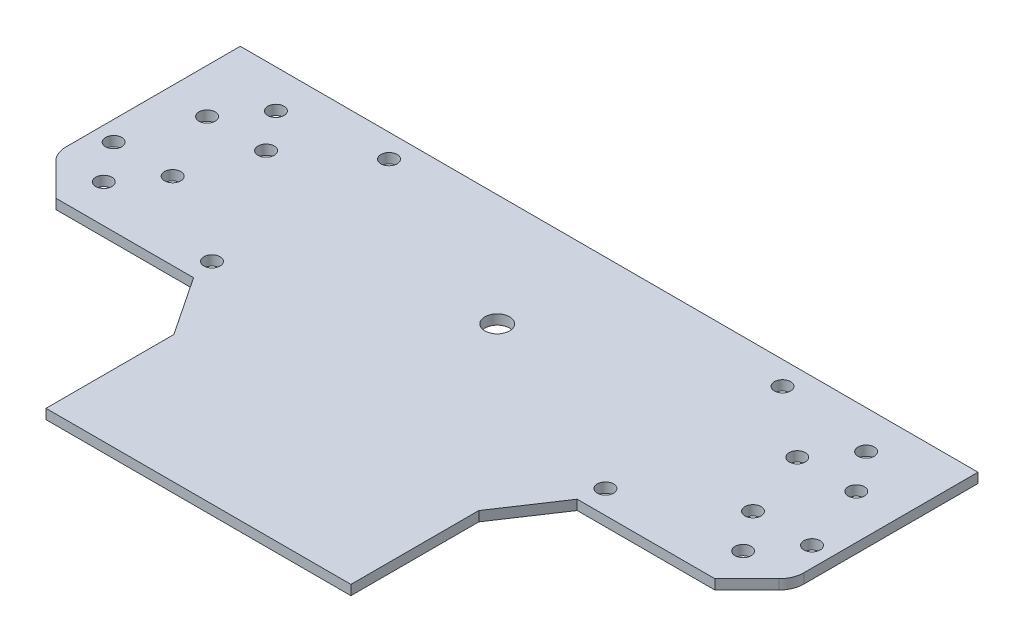
ISO-10303-21;
HEADER;
FILE_DESCRIPTION(('STEP AP214'),'2;1');
FILE_NAME('part.step','',(''),(''),'','','');
FILE_SCHEMA(('AUTOMOTIVE_DESIGN { 1 0 10303 214 1 1 1 1 }'));
ENDSEC;
DATA;
#1=APPLICATION_CONTEXT('core data for automotive mechanical design processes');
#2=APPLICATION_PROTOCOL_DEFINITION('international standard','automotive_design',2000,#1);
#3=PRODUCT_CONTEXT('',#1,'mechanical');
#4=PRODUCT('Part','Part','',(#3));
#5=PRODUCT_RELATED_PRODUCT_CATEGORY('part','',(#4));
#6=PRODUCT_DEFINITION_FORMATION('','',#4);
#7=PRODUCT_DEFINITION_CONTEXT('part definition',#1,'design');
#8=PRODUCT_DEFINITION('design','',#6,#7);
#9=PRODUCT_DEFINITION_SHAPE('','',#8);
#10=(LENGTH_UNIT() NAMED_UNIT(*) SI_UNIT(.MILLI.,.METRE.));
#11=(NAMED_UNIT(*) PLANE_ANGLE_UNIT() SI_UNIT($,.RADIAN.));
#12=(NAMED_UNIT(*) SI_UNIT($,.STERADIAN.) SOLID_ANGLE_UNIT());
#13=UNCERTAINTY_MEASURE_WITH_UNIT(LENGTH_MEASURE(1.E-05),#10,'distance_accuracy_value','');
#14=(GEOMETRIC_REPRESENTATION_CONTEXT(3) GLOBAL_UNCERTAINTY_ASSIGNED_CONTEXT((#13)) GLOBAL_UNIT_ASSIGNED_CONTEXT((#10,
#11,#12)) REPRESENTATION_CONTEXT('',''));
#15=CARTESIAN_POINT('',(0.,0.,0.));
#16=DIRECTION('',(0.,0.,1.));
#17=DIRECTION('',(1.,0.,0.));
#18=AXIS2_PLACEMENT_3D('',#15,#16,#17);
#19=CARTESIAN_POINT('',(-75.,2.,22.75));
#20=DIRECTION('',(0.,0.,-1.));
#21=DIRECTION('',(-1.,0.,0.));
#22=AXIS2_PLACEMENT_3D('',#19,#20,#21);
#23=PLANE('',#22);
#24=DIRECTION('',(0.,-1.,0.));
#25=VECTOR('',#24,1.);
#26=CARTESIAN_POINT('',(39.,16.422205101856,22.75));
#27=LINE('',#26,#25);
#28=CARTESIAN_POINT('',(39.,2.,22.75));
#29=VERTEX_POINT('',#28);
#30=CARTESIAN_POINT('',(39.,0.,22.75));
#31=VERTEX_POINT('',#30);
#32=EDGE_CURVE('E55',#29,#31,#27,.T.);
#33=ORIENTED_EDGE('',*,*,#32,.T.);
#34=DIRECTION('',(1.,0.,0.));
#35=VECTOR('',#34,1.);
#36=CARTESIAN_POINT('',(-75.,0.,22.75));
#37=LINE('',#36,#35);
#38=CARTESIAN_POINT('',(66.9999999999999,0.,22.75));
#39=VERTEX_POINT('',#38);
#40=EDGE_CURVE('E303',#31,#39,#37,.T.);
#41=ORIENTED_EDGE('',*,*,#40,.T.);
#42=DIRECTION('',(0.,1.,0.));
#43=VECTOR('',#42,1.);
#44=CARTESIAN_POINT('',(66.9999999999999,2.,22.75));
#45=LINE('',#44,#43);
#46=CARTESIAN_POINT('',(66.9999999999999,2.,22.75));
#47=VERTEX_POINT('',#46);
#48=EDGE_CURVE('E319',#39,#47,#45,.T.);
#49=ORIENTED_EDGE('',*,*,#48,.T.);
#50=DIRECTION('',(1.,0.,0.));
#51=VECTOR('',#50,1.);
#52=CARTESIAN_POINT('',(-75.,2.,22.75));
#53=LINE('',#52,#51);
#54=EDGE_CURVE('E50',#29,#47,#53,.T.);
#55=ORIENTED_EDGE('',*,*,#54,.F.);
#56=EDGE_LOOP('',(#33,#41,#49,#55));
#57=FACE_BOUND('',#56,.T.);
#58=ADVANCED_FACE('F35',(#57),#23,.F.);
#59=CARTESIAN_POINT('',(31.,74.7186358507914,60.75));
#60=DIRECTION('',(-1.,0.,0.));
#61=DIRECTION('',(0.,0.,1.));
#62=AXIS2_PLACEMENT_3D('',#59,#60,#61);
#63=PLANE('',#62);
#64=DIRECTION('',(0.,-1.,0.));
#65=VECTOR('',#64,1.);
#66=CARTESIAN_POINT('',(31.,16.422205101856,34.75));
#67=LINE('',#66,#65);
#68=CARTESIAN_POINT('',(31.,2.,34.75));
#69=VERTEX_POINT('',#68);
#70=CARTESIAN_POINT('',(31.,0.,34.75));
#71=VERTEX_POINT('',#70);
#72=EDGE_CURVE('E147',#69,#71,#67,.T.);
#73=ORIENTED_EDGE('',*,*,#72,.F.);
#74=DIRECTION('',(0.,0.,1.));
#75=VECTOR('',#74,1.);
#76=CARTESIAN_POINT('',(31.,2.,60.75));
#77=LINE('',#76,#75);
#78=CARTESIAN_POINT('',(31.,2.,60.75));
#79=VERTEX_POINT('',#78);
#80=EDGE_CURVE('E133',#69,#79,#77,.T.);
#81=ORIENTED_EDGE('',*,*,#80,.T.);
#82=DIRECTION('',(0.,-1.,0.));
#83=VECTOR('',#82,1.);
#84=CARTESIAN_POINT('',(31.,74.7186358507914,60.75));
#85=LINE('',#84,#83);
#86=CARTESIAN_POINT('',(31.,0.,60.75));
#87=VERTEX_POINT('',#86);
#88=EDGE_CURVE('E177',#79,#87,#85,.T.);
#89=ORIENTED_EDGE('',*,*,#88,.T.);
#90=DIRECTION('',(0.,0.,-1.));
#91=VECTOR('',#90,1.);
#92=CARTESIAN_POINT('',(31.,0.,60.75));
#93=LINE('',#92,#91);
#94=EDGE_CURVE('E150',#87,#71,#93,.T.);
#95=ORIENTED_EDGE('',*,*,#94,.T.);
#96=EDGE_LOOP('',(#73,#81,#89,#95));
#97=FACE_BOUND('',#96,.T.);
#98=ADVANCED_FACE('F148',(#97),#63,.F.);
#99=DIRECTION('',(0.,-1.,0.));
#100=VECTOR('',#99,1.);
#101=CARTESIAN_POINT('',(-39.,16.422205101856,22.75));
#102=LINE('',#101,#100);
#103=CARTESIAN_POINT('',(-39.,2.,22.75));
#104=VERTEX_POINT('',#103);
#105=CARTESIAN_POINT('',(-39.,0.,22.75));
#106=VERTEX_POINT('',#105);
#107=EDGE_CURVE('E165',#104,#106,#102,.T.);
#108=ORIENTED_EDGE('',*,*,#107,.F.);
#109=CARTESIAN_POINT('',(-67.,2.,22.75));
#110=VERTEX_POINT('',#109);
#111=EDGE_CURVE('E293',#110,#104,#53,.T.);
#112=ORIENTED_EDGE('',*,*,#111,.F.);
#113=DIRECTION('',(0.,-1.,0.));
#114=VECTOR('',#113,1.);
#115=CARTESIAN_POINT('',(-67.,2.,22.75));
#116=LINE('',#115,#114);
#117=CARTESIAN_POINT('',(-67.,0.,22.75));
#118=VERTEX_POINT('',#117);
#119=EDGE_CURVE('E316',#110,#118,#116,.T.);
#120=ORIENTED_EDGE('',*,*,#119,.T.);
#121=EDGE_CURVE('E288',#118,#106,#37,.T.);
#122=ORIENTED_EDGE('',*,*,#121,.T.);
#123=EDGE_LOOP('',(#108,#112,#120,#122));
#124=FACE_BOUND('',#123,.T.);
#125=ADVANCED_FACE('F366',(#124),#23,.F.);
#126=CARTESIAN_POINT('',(-31.,74.7186358507914,60.75));
#127=DIRECTION('',(1.,0.,0.));
#128=DIRECTION('',(0.,0.,-1.));
#129=AXIS2_PLACEMENT_3D('',#126,#127,#128);
#130=PLANE('',#129);
#131=DIRECTION('',(0.,-1.,0.));
#132=VECTOR('',#131,1.);
#133=CARTESIAN_POINT('',(-31.,16.422205101856,34.75));
#134=LINE('',#133,#132);
#135=CARTESIAN_POINT('',(-31.,2.,34.75));
#136=VERTEX_POINT('',#135);
#137=CARTESIAN_POINT('',(-31.,0.,34.75));
#138=VERTEX_POINT('',#137);
#139=EDGE_CURVE('E159',#136,#138,#134,.T.);
#140=ORIENTED_EDGE('',*,*,#139,.T.);
#141=DIRECTION('',(0.,0.,1.));
#142=VECTOR('',#141,1.);
#143=CARTESIAN_POINT('',(-31.,0.,60.75));
#144=LINE('',#143,#142);
#145=CARTESIAN_POINT('',(-31.,0.,60.75));
#146=VERTEX_POINT('',#145);
#147=EDGE_CURVE('E172',#138,#146,#144,.T.);
#148=ORIENTED_EDGE('',*,*,#147,.T.);
#149=DIRECTION('',(0.,-1.,0.));
#150=VECTOR('',#149,1.);
#151=CARTESIAN_POINT('',(-31.,74.7186358507914,60.75));
#152=LINE('',#151,#150);
#153=CARTESIAN_POINT('',(-31.,2.,60.75));
#154=VERTEX_POINT('',#153);
#155=EDGE_CURVE('E179',#154,#146,#152,.T.);
#156=ORIENTED_EDGE('',*,*,#155,.F.);
#157=DIRECTION('',(0.,0.,-1.));
#158=VECTOR('',#157,1.);
#159=CARTESIAN_POINT('',(-31.,2.,60.75));
#160=LINE('',#159,#158);
#161=EDGE_CURVE('E144',#154,#136,#160,.T.);
#162=ORIENTED_EDGE('',*,*,#161,.T.);
#163=EDGE_LOOP('',(#140,#148,#156,#162));
#164=FACE_BOUND('',#163,.T.);
#165=ADVANCED_FACE('F375',(#164),#130,.F.);
#166=CARTESIAN_POINT('',(75.,2.,22.75));
#167=DIRECTION('',(-1.,0.,0.));
#168=DIRECTION('',(0.,0.,1.));
#169=AXIS2_PLACEMENT_3D('',#166,#167,#168);
#170=PLANE('',#169);
#171=DIRECTION('',(0.,0.,-1.));
#172=VECTOR('',#171,1.);
#173=CARTESIAN_POINT('',(75.,2.,22.75));
#174=LINE('',#173,#172);
#175=CARTESIAN_POINT('',(75.,2.,12.6789321881345));
#176=VERTEX_POINT('',#175);
#177=CARTESIAN_POINT('',(75.,2.,-22.75));
#178=VERTEX_POINT('',#177);
#179=EDGE_CURVE('E285',#176,#178,#174,.T.);
#180=ORIENTED_EDGE('',*,*,#179,.F.);
#181=DIRECTION('',(0.,1.,0.));
#182=VECTOR('',#181,1.);
#183=CARTESIAN_POINT('',(75.,0.,12.6789321881345));
#184=LINE('',#183,#182);
#185=CARTESIAN_POINT('',(75.,0.,12.6789321881345));
#186=VERTEX_POINT('',#185);
#187=EDGE_CURVE('E326',#176,#186,#184,.F.);
#188=ORIENTED_EDGE('',*,*,#187,.T.);
#189=DIRECTION('',(0.,0.,-1.));
#190=VECTOR('',#189,1.);
#191=CARTESIAN_POINT('',(75.,0.,22.75));
#192=LINE('',#191,#190);
#193=CARTESIAN_POINT('',(75.,0.,-22.75));
#194=VERTEX_POINT('',#193);
#195=EDGE_CURVE('E252',#186,#194,#192,.T.);
#196=ORIENTED_EDGE('',*,*,#195,.T.);
#197=DIRECTION('',(0.,-1.,0.));
#198=VECTOR('',#197,1.);
#199=CARTESIAN_POINT('',(75.,2.,-22.75));
#200=LINE('',#199,#198);
#201=EDGE_CURVE('E307',#178,#194,#200,.T.);
#202=ORIENTED_EDGE('',*,*,#201,.F.);
#203=EDGE_LOOP('',(#180,#188,#196,#202));
#204=FACE_BOUND('',#203,.T.);
#205=ADVANCED_FACE('F391',(#204),#170,.F.);
#206=CARTESIAN_POINT('',(-75.,2.,-22.75));
#207=DIRECTION('',(0.,0.,1.));
#208=DIRECTION('',(1.,0.,0.));
#209=AXIS2_PLACEMENT_3D('',#206,#207,#208);
#210=PLANE('',#209);
#211=DIRECTION('',(-1.,0.,0.));
#212=VECTOR('',#211,1.);
#213=CARTESIAN_POINT('',(-75.,0.,-22.75));
#214=LINE('',#213,#212);
#215=CARTESIAN_POINT('',(-75.,0.,-22.75));
#216=VERTEX_POINT('',#215);
#217=EDGE_CURVE('E298',#194,#216,#214,.T.);
#218=ORIENTED_EDGE('',*,*,#217,.T.);
#219=DIRECTION('',(0.,-1.,0.));
#220=VECTOR('',#219,1.);
#221=CARTESIAN_POINT('',(-75.,2.,-22.75));
#222=LINE('',#221,#220);
#223=CARTESIAN_POINT('',(-75.,2.,-22.75));
#224=VERTEX_POINT('',#223);
#225=EDGE_CURVE('E296',#224,#216,#222,.T.);
#226=ORIENTED_EDGE('',*,*,#225,.F.);
#227=DIRECTION('',(-1.,0.,0.));
#228=VECTOR('',#227,1.);
#229=CARTESIAN_POINT('',(-75.,2.,-22.75));
#230=LINE('',#229,#228);
#231=EDGE_CURVE('E287',#178,#224,#230,.T.);
#232=ORIENTED_EDGE('',*,*,#231,.F.);
#233=ORIENTED_EDGE('',*,*,#201,.T.);
#234=EDGE_LOOP('',(#218,#226,#232,#233));
#235=FACE_BOUND('',#234,.T.);
#236=ADVANCED_FACE('F352',(#235),#210,.F.);
#237=CARTESIAN_POINT('',(-75.,2.,22.75));
#238=DIRECTION('',(1.,0.,0.));
#239=DIRECTION('',(0.,0.,-1.));
#240=AXIS2_PLACEMENT_3D('',#237,#238,#239);
#241=PLANE('',#240);
#242=DIRECTION('',(0.,0.,1.));
#243=VECTOR('',#242,1.);
#244=CARTESIAN_POINT('',(-75.,0.,22.75));
#245=LINE('',#244,#243);
#246=CARTESIAN_POINT('',(-75.,0.,12.6789321881345));
#247=VERTEX_POINT('',#246);
#248=EDGE_CURVE('E300',#216,#247,#245,.T.);
#249=ORIENTED_EDGE('',*,*,#248,.T.);
#250=DIRECTION('',(0.,-1.,0.));
#251=VECTOR('',#250,1.);
#252=CARTESIAN_POINT('',(-75.,2.,12.6789321881345));
#253=LINE('',#252,#251);
#254=CARTESIAN_POINT('',(-75.,2.,12.6789321881345));
#255=VERTEX_POINT('',#254);
#256=EDGE_CURVE('E43',#247,#255,#253,.F.);
#257=ORIENTED_EDGE('',*,*,#256,.T.);
#258=DIRECTION('',(0.,0.,1.));
#259=VECTOR('',#258,1.);
#260=CARTESIAN_POINT('',(-75.,2.,22.75));
#261=LINE('',#260,#259);
#262=EDGE_CURVE('E290',#224,#255,#261,.T.);
#263=ORIENTED_EDGE('',*,*,#262,.F.);
#264=ORIENTED_EDGE('',*,*,#225,.T.);
#265=EDGE_LOOP('',(#249,#257,#263,#264));
#266=FACE_BOUND('',#265,.T.);
#267=ADVANCED_FACE('F342',(#266),#241,.F.);
#268=CARTESIAN_POINT('',(0.,2.,0.));
#269=DIRECTION('',(0.,-1.,0.));
#270=DIRECTION('',(0.,0.,-1.));
#271=AXIS2_PLACEMENT_3D('',#268,#269,#270);
#272=PLANE('',#271);
#273=DIRECTION('',(-0.554700196225229,0.,0.832050294337844));
#274=VECTOR('',#273,1.);
#275=CARTESIAN_POINT('',(31.,2.,34.75));
#276=LINE('',#275,#274);
#277=EDGE_CURVE('E138',#29,#69,#276,.T.);
#278=ORIENTED_EDGE('',*,*,#277,.F.);
#279=ORIENTED_EDGE('',*,*,#54,.T.);
#280=DIRECTION('',(-0.707106781186549,0.,0.707106781186546));
#281=VECTOR('',#280,1.);
#282=CARTESIAN_POINT('',(75.,2.,14.75));
#283=LINE('',#282,#281);
#284=CARTESIAN_POINT('',(73.5355339059327,2.,16.2144660940673));
#285=VERTEX_POINT('',#284);
#286=EDGE_CURVE('E323',#47,#285,#283,.F.);
#287=ORIENTED_EDGE('',*,*,#286,.T.);
#288=CARTESIAN_POINT('',(70.,2.,12.6789321881345));
#289=DIRECTION('',(0.,-1.,0.));
#290=DIRECTION('',(0.,0.,-1.));
#291=AXIS2_PLACEMENT_3D('',#288,#289,#290);
#292=CIRCLE('',#291,5.);
#293=EDGE_CURVE('E337',#285,#176,#292,.F.);
#294=ORIENTED_EDGE('',*,*,#293,.T.);
#295=ORIENTED_EDGE('',*,*,#179,.T.);
#296=ORIENTED_EDGE('',*,*,#231,.T.);
#297=ORIENTED_EDGE('',*,*,#262,.T.);
#298=CARTESIAN_POINT('',(-70.,2.,12.6789321881345));
#299=DIRECTION('',(0.,-1.,0.));
#300=DIRECTION('',(0.,0.,-1.));
#301=AXIS2_PLACEMENT_3D('',#298,#299,#300);
#302=CIRCLE('',#301,5.);
#303=CARTESIAN_POINT('',(-73.5355339059328,2.,16.2144660940673));
#304=VERTEX_POINT('',#303);
#305=EDGE_CURVE('E335',#255,#304,#302,.F.);
#306=ORIENTED_EDGE('',*,*,#305,.T.);
#307=DIRECTION('',(-0.707106781186547,0.,-0.707106781186548));
#308=VECTOR('',#307,1.);
#309=CARTESIAN_POINT('',(-67.,2.,22.75));
#310=LINE('',#309,#308);
#311=EDGE_CURVE('E321',#304,#110,#310,.F.);
#312=ORIENTED_EDGE('',*,*,#311,.T.);
#313=ORIENTED_EDGE('',*,*,#111,.T.);
#314=DIRECTION('',(-0.554700196225229,0.,-0.832050294337844));
#315=VECTOR('',#314,1.);
#316=CARTESIAN_POINT('',(-31.,2.,34.75));
#317=LINE('',#316,#315);
#318=EDGE_CURVE('E163',#136,#104,#317,.T.);
#319=ORIENTED_EDGE('',*,*,#318,.F.);
#320=ORIENTED_EDGE('',*,*,#161,.F.);
#321=DIRECTION('',(-1.,0.,0.));
#322=VECTOR('',#321,1.);
#323=CARTESIAN_POINT('',(-31.,2.,60.75));
#324=LINE('',#323,#322);
#325=EDGE_CURVE('E140',#79,#154,#324,.T.);
#326=ORIENTED_EDGE('',*,*,#325,.F.);
#327=ORIENTED_EDGE('',*,*,#80,.F.);
#328=EDGE_LOOP('',(#278,#279,#287,#294,#295,#296,#297,#306,#312,#313,#319,#320,#326,#327));
#329=FACE_BOUND('',#328,.T.);
#330=CARTESIAN_POINT('',(-40.,2.,18.));
#331=DIRECTION('',(0.,1.,0.));
#332=DIRECTION('',(0.,0.,1.));
#333=AXIS2_PLACEMENT_3D('',#330,#331,#332);
#334=CIRCLE('',#333,1.65);
#335=CARTESIAN_POINT('',(-40.,2.,19.65));
#336=VERTEX_POINT('',#335);
#337=EDGE_CURVE('E189',#336,#336,#334,.T.);
#338=ORIENTED_EDGE('',*,*,#337,.F.);
#339=EDGE_LOOP('',(#338));
#340=FACE_BOUND('',#339,.T.);
#341=CARTESIAN_POINT('',(40.,2.,-18.));
#342=DIRECTION('',(0.,1.,0.));
#343=DIRECTION('',(0.,0.,1.));
#344=AXIS2_PLACEMENT_3D('',#341,#342,#343);
#345=CIRCLE('',#344,1.65);
#346=CARTESIAN_POINT('',(40.,2.,-16.35));
#347=VERTEX_POINT('',#346);
#348=EDGE_CURVE('E196',#347,#347,#345,.T.);
#349=ORIENTED_EDGE('',*,*,#348,.F.);
#350=EDGE_LOOP('',(#349));
#351=FACE_BOUND('',#350,.T.);
#352=CARTESIAN_POINT('',(40.,2.,18.));
#353=DIRECTION('',(0.,1.,0.));
#354=DIRECTION('',(0.,0.,1.));
#355=AXIS2_PLACEMENT_3D('',#352,#353,#354);
#356=CIRCLE('',#355,1.65);
#357=CARTESIAN_POINT('',(40.,2.,19.65));
#358=VERTEX_POINT('',#357);
#359=EDGE_CURVE('E183',#358,#358,#356,.T.);
#360=ORIENTED_EDGE('',*,*,#359,.F.);
#361=EDGE_LOOP('',(#360));
#362=FACE_BOUND('',#361,.T.);
#363=CARTESIAN_POINT('',(-40.,2.,-18.));
#364=DIRECTION('',(0.,1.,0.));
#365=DIRECTION('',(0.,0.,1.));
#366=AXIS2_PLACEMENT_3D('',#363,#364,#365);
#367=CIRCLE('',#366,1.65);
#368=CARTESIAN_POINT('',(-40.,2.,-16.35));
#369=VERTEX_POINT('',#368);
#370=EDGE_CURVE('E201',#369,#369,#367,.T.);
#371=ORIENTED_EDGE('',*,*,#370,.F.);
#372=EDGE_LOOP('',(#371));
#373=FACE_BOUND('',#372,.T.);
#374=CARTESIAN_POINT('',(0.,2.,0.));
#375=DIRECTION('',(0.,1.,0.));
#376=DIRECTION('',(0.,0.,1.));
#377=AXIS2_PLACEMENT_3D('',#374,#375,#376);
#378=CIRCLE('',#377,2.5);
#379=CARTESIAN_POINT('',(0.,2.,2.5));
#380=VERTEX_POINT('',#379);
#381=EDGE_CURVE('E207',#380,#380,#378,.T.);
#382=ORIENTED_EDGE('',*,*,#381,.F.);
#383=EDGE_LOOP('',(#382));
#384=FACE_BOUND('',#383,.T.);
#385=CARTESIAN_POINT('',(60.,2.,-15.));
#386=DIRECTION('',(0.,-1.,0.));
#387=DIRECTION('',(0.,0.,1.));
#388=AXIS2_PLACEMENT_3D('',#385,#386,#387);
#389=CIRCLE('',#388,1.64999999999999);
#390=CARTESIAN_POINT('',(60.,2.,-13.35));
#391=VERTEX_POINT('',#390);
#392=EDGE_CURVE('E213',#391,#391,#389,.T.);
#393=ORIENTED_EDGE('',*,*,#392,.T.);
#394=EDGE_LOOP('',(#393));
#395=FACE_BOUND('',#394,.T.);
#396=CARTESIAN_POINT('',(65.9999999999999,2.,-7.));
#397=DIRECTION('',(0.,-1.,0.));
#398=DIRECTION('',(0.,0.,1.));
#399=AXIS2_PLACEMENT_3D('',#396,#397,#398);
#400=CIRCLE('',#399,1.65);
#401=CARTESIAN_POINT('',(65.9999999999999,2.,-5.35));
#402=VERTEX_POINT('',#401);
#403=EDGE_CURVE('E221',#402,#402,#400,.T.);
#404=ORIENTED_EDGE('',*,*,#403,.T.);
#405=EDGE_LOOP('',(#404));
#406=FACE_BOUND('',#405,.T.);
#407=CARTESIAN_POINT('',(54.,2.,-7.));
#408=DIRECTION('',(0.,-1.,0.));
#409=DIRECTION('',(0.,0.,1.));
#410=AXIS2_PLACEMENT_3D('',#407,#408,#409);
#411=CIRCLE('',#410,1.65);
#412=CARTESIAN_POINT('',(54.,2.,-5.35));
#413=VERTEX_POINT('',#412);
#414=EDGE_CURVE('E227',#413,#413,#411,.T.);
#415=ORIENTED_EDGE('',*,*,#414,.T.);
#416=EDGE_LOOP('',(#415));
#417=FACE_BOUND('',#416,.T.);
#418=CARTESIAN_POINT('',(70.9999999999999,2.,7.));
#419=DIRECTION('',(0.,-1.,0.));
#420=DIRECTION('',(0.,0.,1.));
#421=AXIS2_PLACEMENT_3D('',#418,#419,#420);
#422=CIRCLE('',#421,1.65);
#423=CARTESIAN_POINT('',(70.9999999999999,2.,8.65000000000001));
#424=VERTEX_POINT('',#423);
#425=EDGE_CURVE('E233',#424,#424,#422,.T.);
#426=ORIENTED_EDGE('',*,*,#425,.T.);
#427=EDGE_LOOP('',(#426));
#428=FACE_BOUND('',#427,.T.);
#429=CARTESIAN_POINT('',(58.9999999999999,2.,7.));
#430=DIRECTION('',(0.,-1.,0.));
#431=DIRECTION('',(0.,0.,1.));
#432=AXIS2_PLACEMENT_3D('',#429,#430,#431);
#433=CIRCLE('',#432,1.65);
#434=CARTESIAN_POINT('',(58.9999999999999,2.,8.65000000000001));
#435=VERTEX_POINT('',#434);
#436=EDGE_CURVE('E239',#435,#435,#433,.T.);
#437=ORIENTED_EDGE('',*,*,#436,.T.);
#438=EDGE_LOOP('',(#437));
#439=FACE_BOUND('',#438,.T.);
#440=CARTESIAN_POINT('',(64.9999999999999,2.,15.));
#441=DIRECTION('',(0.,-1.,0.));
#442=DIRECTION('',(0.,0.,1.));
#443=AXIS2_PLACEMENT_3D('',#440,#441,#442);
#444=CIRCLE('',#443,1.65);
#445=CARTESIAN_POINT('',(64.9999999999999,2.,16.65));
#446=VERTEX_POINT('',#445);
#447=EDGE_CURVE('E210',#446,#446,#444,.T.);
#448=ORIENTED_EDGE('',*,*,#447,.T.);
#449=EDGE_LOOP('',(#448));
#450=FACE_BOUND('',#449,.T.);
#451=CARTESIAN_POINT('',(-60.,2.,-15.));
#452=DIRECTION('',(0.,1.,0.));
#453=DIRECTION('',(0.,0.,1.));
#454=AXIS2_PLACEMENT_3D('',#451,#452,#453);
#455=CIRCLE('',#454,1.64999999999999);
#456=CARTESIAN_POINT('',(-60.,2.,-13.35));
#457=VERTEX_POINT('',#456);
#458=EDGE_CURVE('E249',#457,#457,#455,.T.);
#459=ORIENTED_EDGE('',*,*,#458,.F.);
#460=EDGE_LOOP('',(#459));
#461=FACE_BOUND('',#460,.T.);
#462=CARTESIAN_POINT('',(-65.9999999999999,2.,-7.));
#463=DIRECTION('',(0.,1.,0.));
#464=DIRECTION('',(0.,0.,1.));
#465=AXIS2_PLACEMENT_3D('',#462,#463,#464);
#466=CIRCLE('',#465,1.65);
#467=CARTESIAN_POINT('',(-65.9999999999999,2.,-5.35));
#468=VERTEX_POINT('',#467);
#469=EDGE_CURVE('E256',#468,#468,#466,.T.);
#470=ORIENTED_EDGE('',*,*,#469,.F.);
#471=EDGE_LOOP('',(#470));
#472=FACE_BOUND('',#471,.T.);
#473=CARTESIAN_POINT('',(-54.,2.,-7.));
#474=DIRECTION('',(0.,1.,0.));
#475=DIRECTION('',(0.,0.,1.));
#476=AXIS2_PLACEMENT_3D('',#473,#474,#475);
#477=CIRCLE('',#476,1.65);
#478=CARTESIAN_POINT('',(-54.,2.,-5.35));
#479=VERTEX_POINT('',#478);
#480=EDGE_CURVE('E262',#479,#479,#477,.T.);
#481=ORIENTED_EDGE('',*,*,#480,.F.);
#482=EDGE_LOOP('',(#481));
#483=FACE_BOUND('',#482,.T.);
#484=CARTESIAN_POINT('',(-70.9999999999999,2.,7.));
#485=DIRECTION('',(0.,1.,0.));
#486=DIRECTION('',(0.,0.,1.));
#487=AXIS2_PLACEMENT_3D('',#484,#485,#486);
#488=CIRCLE('',#487,1.65);
#489=CARTESIAN_POINT('',(-70.9999999999999,2.,8.65000000000001));
#490=VERTEX_POINT('',#489);
#491=EDGE_CURVE('E268',#490,#490,#488,.T.);
#492=ORIENTED_EDGE('',*,*,#491,.F.);
#493=EDGE_LOOP('',(#492));
#494=FACE_BOUND('',#493,.T.);
#495=CARTESIAN_POINT('',(-58.9999999999999,2.,7.));
#496=DIRECTION('',(0.,1.,0.));
#497=DIRECTION('',(0.,0.,1.));
#498=AXIS2_PLACEMENT_3D('',#495,#496,#497);
#499=CIRCLE('',#498,1.65);
#500=CARTESIAN_POINT('',(-58.9999999999999,2.,8.65000000000001));
#501=VERTEX_POINT('',#500);
#502=EDGE_CURVE('E274',#501,#501,#499,.T.);
#503=ORIENTED_EDGE('',*,*,#502,.F.);
#504=EDGE_LOOP('',(#503));
#505=FACE_BOUND('',#504,.T.);
#506=CARTESIAN_POINT('',(-64.9999999999999,2.,15.));
#507=DIRECTION('',(0.,1.,0.));
#508=DIRECTION('',(0.,0.,1.));
#509=AXIS2_PLACEMENT_3D('',#506,#507,#508);
#510=CIRCLE('',#509,1.65);
#511=CARTESIAN_POINT('',(-64.9999999999999,2.,16.65));
#512=VERTEX_POINT('',#511);
#513=EDGE_CURVE('E280',#512,#512,#510,.T.);
#514=ORIENTED_EDGE('',*,*,#513,.F.);
#515=EDGE_LOOP('',(#514));
#516=FACE_BOUND('',#515,.T.);
#517=ADVANCED_FACE('F135',(#329,#340,#351,#362,#373,#384,#395,#406,#417,#428,#439,#450,#461,
#472,#483,#494,#505,#516),#272,.F.);
#518=CARTESIAN_POINT('',(0.,0.,0.));
#519=DIRECTION('',(0.,-1.,0.));
#520=DIRECTION('',(0.,0.,-1.));
#521=AXIS2_PLACEMENT_3D('',#518,#519,#520);
#522=PLANE('',#521);
#523=ORIENTED_EDGE('',*,*,#40,.F.);
#524=DIRECTION('',(0.554700196225229,0.,-0.832050294337844));
#525=VECTOR('',#524,1.);
#526=CARTESIAN_POINT('',(31.,0.,34.75));
#527=LINE('',#526,#525);
#528=EDGE_CURVE('E378',#71,#31,#527,.T.);
#529=ORIENTED_EDGE('',*,*,#528,.F.);
#530=ORIENTED_EDGE('',*,*,#94,.F.);
#531=DIRECTION('',(1.,0.,0.));
#532=VECTOR('',#531,1.);
#533=CARTESIAN_POINT('',(-31.,0.,60.75));
#534=LINE('',#533,#532);
#535=EDGE_CURVE('E174',#146,#87,#534,.T.);
#536=ORIENTED_EDGE('',*,*,#535,.F.);
#537=ORIENTED_EDGE('',*,*,#147,.F.);
#538=DIRECTION('',(0.554700196225229,0.,0.832050294337844));
#539=VECTOR('',#538,1.);
#540=CARTESIAN_POINT('',(-31.,0.,34.75));
#541=LINE('',#540,#539);
#542=EDGE_CURVE('E156',#106,#138,#541,.T.);
#543=ORIENTED_EDGE('',*,*,#542,.F.);
#544=ORIENTED_EDGE('',*,*,#121,.F.);
#545=DIRECTION('',(0.707106781186547,0.,0.707106781186548));
#546=VECTOR('',#545,1.);
#547=CARTESIAN_POINT('',(-44.8750000000001,0.,44.875));
#548=LINE('',#547,#546);
#549=CARTESIAN_POINT('',(-73.5355339059328,0.,16.2144660940673));
#550=VERTEX_POINT('',#549);
#551=EDGE_CURVE('E310',#118,#550,#548,.F.);
#552=ORIENTED_EDGE('',*,*,#551,.T.);
#553=CARTESIAN_POINT('',(-70.,0.,12.6789321881345));
#554=DIRECTION('',(0.,-1.,0.));
#555=DIRECTION('',(0.,0.,-1.));
#556=AXIS2_PLACEMENT_3D('',#553,#554,#555);
#557=CIRCLE('',#556,5.);
#558=EDGE_CURVE('E329',#550,#247,#557,.T.);
#559=ORIENTED_EDGE('',*,*,#558,.T.);
#560=ORIENTED_EDGE('',*,*,#248,.F.);
#561=ORIENTED_EDGE('',*,*,#217,.F.);
#562=ORIENTED_EDGE('',*,*,#195,.F.);
#563=CARTESIAN_POINT('',(70.,0.,12.6789321881345));
#564=DIRECTION('',(0.,-1.,0.));
#565=DIRECTION('',(0.,0.,-1.));
#566=AXIS2_PLACEMENT_3D('',#563,#564,#565);
#567=CIRCLE('',#566,5.);
#568=CARTESIAN_POINT('',(73.5355339059327,0.,16.2144660940673));
#569=VERTEX_POINT('',#568);
#570=EDGE_CURVE('E331',#186,#569,#567,.T.);
#571=ORIENTED_EDGE('',*,*,#570,.T.);
#572=DIRECTION('',(0.707106781186549,0.,-0.707106781186546));
#573=VECTOR('',#572,1.);
#574=CARTESIAN_POINT('',(44.8749999999998,0.,44.875));
#575=LINE('',#574,#573);
#576=EDGE_CURVE('E313',#569,#39,#575,.F.);
#577=ORIENTED_EDGE('',*,*,#576,.T.);
#578=EDGE_LOOP('',(#523,#529,#530,#536,#537,#543,#544,#552,#559,#560,#561,#562,#571,#577));
#579=FACE_BOUND('',#578,.T.);
#580=CARTESIAN_POINT('',(-40.,0.,18.));
#581=DIRECTION('',(0.,-1.,0.));
#582=DIRECTION('',(0.,0.,-1.));
#583=AXIS2_PLACEMENT_3D('',#580,#581,#582);
#584=CIRCLE('',#583,1.65);
#585=CARTESIAN_POINT('',(-40.,0.,16.35));
#586=VERTEX_POINT('',#585);
#587=EDGE_CURVE('E193',#586,#586,#584,.F.);
#588=ORIENTED_EDGE('',*,*,#587,.T.);
#589=EDGE_LOOP('',(#588));
#590=FACE_BOUND('',#589,.T.);
#591=CARTESIAN_POINT('',(40.,0.,-18.));
#592=DIRECTION('',(0.,-1.,0.));
#593=DIRECTION('',(0.,0.,-1.));
#594=AXIS2_PLACEMENT_3D('',#591,#592,#593);
#595=CIRCLE('',#594,1.65);
#596=CARTESIAN_POINT('',(40.,0.,-19.65));
#597=VERTEX_POINT('',#596);
#598=EDGE_CURVE('E186',#597,#597,#595,.F.);
#599=ORIENTED_EDGE('',*,*,#598,.T.);
#600=EDGE_LOOP('',(#599));
#601=FACE_BOUND('',#600,.T.);
#602=CARTESIAN_POINT('',(40.,0.,18.));
#603=DIRECTION('',(0.,-1.,0.));
#604=DIRECTION('',(0.,0.,-1.));
#605=AXIS2_PLACEMENT_3D('',#602,#603,#604);
#606=CIRCLE('',#605,1.65);
#607=CARTESIAN_POINT('',(40.,0.,16.35));
#608=VERTEX_POINT('',#607);
#609=EDGE_CURVE('E143',#608,#608,#606,.F.);
#610=ORIENTED_EDGE('',*,*,#609,.T.);
#611=EDGE_LOOP('',(#610));
#612=FACE_BOUND('',#611,.T.);
#613=CARTESIAN_POINT('',(-40.,0.,-18.));
#614=DIRECTION('',(0.,-1.,0.));
#615=DIRECTION('',(0.,0.,-1.));
#616=AXIS2_PLACEMENT_3D('',#613,#614,#615);
#617=CIRCLE('',#616,1.65);
#618=CARTESIAN_POINT('',(-40.,0.,-19.65));
#619=VERTEX_POINT('',#618);
#620=EDGE_CURVE('E192',#619,#619,#617,.F.);
#621=ORIENTED_EDGE('',*,*,#620,.T.);
#622=EDGE_LOOP('',(#621));
#623=FACE_BOUND('',#622,.T.);
#624=CARTESIAN_POINT('',(0.,0.,0.));
#625=DIRECTION('',(0.,-1.,0.));
#626=DIRECTION('',(0.,0.,-1.));
#627=AXIS2_PLACEMENT_3D('',#624,#625,#626);
#628=CIRCLE('',#627,2.5);
#629=CARTESIAN_POINT('',(0.,0.,-2.5));
#630=VERTEX_POINT('',#629);
#631=EDGE_CURVE('E204',#630,#630,#628,.F.);
#632=ORIENTED_EDGE('',*,*,#631,.T.);
#633=EDGE_LOOP('',(#632));
#634=FACE_BOUND('',#633,.T.);
#635=CARTESIAN_POINT('',(60.,0.,-15.));
#636=DIRECTION('',(0.,-1.,0.));
#637=DIRECTION('',(0.,0.,-1.));
#638=AXIS2_PLACEMENT_3D('',#635,#636,#637);
#639=CIRCLE('',#638,1.64999999999999);
#640=CARTESIAN_POINT('',(60.,0.,-16.65));
#641=VERTEX_POINT('',#640);
#642=EDGE_CURVE('E216',#641,#641,#639,.T.);
#643=ORIENTED_EDGE('',*,*,#642,.F.);
#644=EDGE_LOOP('',(#643));
#645=FACE_BOUND('',#644,.T.);
#646=CARTESIAN_POINT('',(65.9999999999999,0.,-7.));
#647=DIRECTION('',(0.,-1.,0.));
#648=DIRECTION('',(0.,0.,-1.));
#649=AXIS2_PLACEMENT_3D('',#646,#647,#648);
#650=CIRCLE('',#649,1.65);
#651=CARTESIAN_POINT('',(65.9999999999999,0.,-8.65));
#652=VERTEX_POINT('',#651);
#653=EDGE_CURVE('E217',#652,#652,#650,.T.);
#654=ORIENTED_EDGE('',*,*,#653,.F.);
#655=EDGE_LOOP('',(#654));
#656=FACE_BOUND('',#655,.T.);
#657=CARTESIAN_POINT('',(54.,0.,-7.));
#658=DIRECTION('',(0.,-1.,0.));
#659=DIRECTION('',(0.,0.,-1.));
#660=AXIS2_PLACEMENT_3D('',#657,#658,#659);
#661=CIRCLE('',#660,1.65);
#662=CARTESIAN_POINT('',(54.,0.,-8.65));
#663=VERTEX_POINT('',#662);
#664=EDGE_CURVE('E224',#663,#663,#661,.T.);
#665=ORIENTED_EDGE('',*,*,#664,.F.);
#666=EDGE_LOOP('',(#665));
#667=FACE_BOUND('',#666,.T.);
#668=CARTESIAN_POINT('',(70.9999999999999,0.,7.));
#669=DIRECTION('',(0.,-1.,0.));
#670=DIRECTION('',(0.,0.,-1.));
#671=AXIS2_PLACEMENT_3D('',#668,#669,#670);
#672=CIRCLE('',#671,1.65);
#673=CARTESIAN_POINT('',(70.9999999999999,0.,5.35));
#674=VERTEX_POINT('',#673);
#675=EDGE_CURVE('E230',#674,#674,#672,.T.);
#676=ORIENTED_EDGE('',*,*,#675,.F.);
#677=EDGE_LOOP('',(#676));
#678=FACE_BOUND('',#677,.T.);
#679=CARTESIAN_POINT('',(58.9999999999999,0.,7.));
#680=DIRECTION('',(0.,-1.,0.));
#681=DIRECTION('',(0.,0.,-1.));
#682=AXIS2_PLACEMENT_3D('',#679,#680,#681);
#683=CIRCLE('',#682,1.65);
#684=CARTESIAN_POINT('',(58.9999999999999,0.,5.35));
#685=VERTEX_POINT('',#684);
#686=EDGE_CURVE('E236',#685,#685,#683,.T.);
#687=ORIENTED_EDGE('',*,*,#686,.F.);
#688=EDGE_LOOP('',(#687));
#689=FACE_BOUND('',#688,.T.);
#690=CARTESIAN_POINT('',(64.9999999999999,0.,15.));
#691=DIRECTION('',(0.,-1.,0.));
#692=DIRECTION('',(0.,0.,-1.));
#693=AXIS2_PLACEMENT_3D('',#690,#691,#692);
#694=CIRCLE('',#693,1.65);
#695=CARTESIAN_POINT('',(64.9999999999999,0.,13.35));
#696=VERTEX_POINT('',#695);
#697=EDGE_CURVE('E242',#696,#696,#694,.T.);
#698=ORIENTED_EDGE('',*,*,#697,.F.);
#699=EDGE_LOOP('',(#698));
#700=FACE_BOUND('',#699,.T.);
#701=CARTESIAN_POINT('',(-60.,0.,-15.));
#702=DIRECTION('',(0.,-1.,0.));
#703=DIRECTION('',(0.,0.,-1.));
#704=AXIS2_PLACEMENT_3D('',#701,#702,#703);
#705=CIRCLE('',#704,1.64999999999999);
#706=CARTESIAN_POINT('',(-60.,0.,-16.65));
#707=VERTEX_POINT('',#706);
#708=EDGE_CURVE('E253',#707,#707,#705,.F.);
#709=ORIENTED_EDGE('',*,*,#708,.T.);
#710=EDGE_LOOP('',(#709));
#711=FACE_BOUND('',#710,.T.);
#712=CARTESIAN_POINT('',(-65.9999999999999,0.,-7.));
#713=DIRECTION('',(0.,-1.,0.));
#714=DIRECTION('',(0.,0.,-1.));
#715=AXIS2_PLACEMENT_3D('',#712,#713,#714);
#716=CIRCLE('',#715,1.65);
#717=CARTESIAN_POINT('',(-65.9999999999999,0.,-8.65));
#718=VERTEX_POINT('',#717);
#719=EDGE_CURVE('E259',#718,#718,#716,.F.);
#720=ORIENTED_EDGE('',*,*,#719,.T.);
#721=EDGE_LOOP('',(#720));
#722=FACE_BOUND('',#721,.T.);
#723=CARTESIAN_POINT('',(-54.,0.,-7.));
#724=DIRECTION('',(0.,-1.,0.));
#725=DIRECTION('',(0.,0.,-1.));
#726=AXIS2_PLACEMENT_3D('',#723,#724,#725);
#727=CIRCLE('',#726,1.65);
#728=CARTESIAN_POINT('',(-54.,0.,-8.65));
#729=VERTEX_POINT('',#728);
#730=EDGE_CURVE('E265',#729,#729,#727,.F.);
#731=ORIENTED_EDGE('',*,*,#730,.T.);
#732=EDGE_LOOP('',(#731));
#733=FACE_BOUND('',#732,.T.);
#734=CARTESIAN_POINT('',(-70.9999999999999,0.,7.));
#735=DIRECTION('',(0.,-1.,0.));
#736=DIRECTION('',(0.,0.,-1.));
#737=AXIS2_PLACEMENT_3D('',#734,#735,#736);
#738=CIRCLE('',#737,1.65);
#739=CARTESIAN_POINT('',(-70.9999999999999,0.,5.35));
#740=VERTEX_POINT('',#739);
#741=EDGE_CURVE('E271',#740,#740,#738,.F.);
#742=ORIENTED_EDGE('',*,*,#741,.T.);
#743=EDGE_LOOP('',(#742));
#744=FACE_BOUND('',#743,.T.);
#745=CARTESIAN_POINT('',(-58.9999999999999,0.,7.));
#746=DIRECTION('',(0.,-1.,0.));
#747=DIRECTION('',(0.,0.,-1.));
#748=AXIS2_PLACEMENT_3D('',#745,#746,#747);
#749=CIRCLE('',#748,1.65);
#750=CARTESIAN_POINT('',(-58.9999999999999,0.,5.35));
#751=VERTEX_POINT('',#750);
#752=EDGE_CURVE('E277',#751,#751,#749,.F.);
#753=ORIENTED_EDGE('',*,*,#752,.T.);
#754=EDGE_LOOP('',(#753));
#755=FACE_BOUND('',#754,.T.);
#756=CARTESIAN_POINT('',(-64.9999999999999,0.,15.));
#757=DIRECTION('',(0.,-1.,0.));
#758=DIRECTION('',(0.,0.,-1.));
#759=AXIS2_PLACEMENT_3D('',#756,#757,#758);
#760=CIRCLE('',#759,1.65);
#761=CARTESIAN_POINT('',(-64.9999999999999,0.,13.35));
#762=VERTEX_POINT('',#761);
#763=EDGE_CURVE('E220',#762,#762,#760,.F.);
#764=ORIENTED_EDGE('',*,*,#763,.T.);
#765=EDGE_LOOP('',(#764));
#766=FACE_BOUND('',#765,.T.);
#767=ADVANCED_FACE('F355',(#579,#590,#601,#612,#623,#634,#645,#656,#667,#678,#689,#700,#711,
#722,#733,#744,#755,#766),#522,.T.);
#768=CARTESIAN_POINT('',(-64.9999999999999,-0.00100000000000013,15.));
#769=DIRECTION('',(0.,1.,0.));
#770=DIRECTION('',(0.,0.,1.));
#771=AXIS2_PLACEMENT_3D('',#768,#769,#770);
#772=CYLINDRICAL_SURFACE('',#771,1.65);
#773=ORIENTED_EDGE('',*,*,#763,.F.);
#774=EDGE_LOOP('',(#773));
#775=FACE_BOUND('',#774,.T.);
#776=ORIENTED_EDGE('',*,*,#513,.T.);
#777=EDGE_LOOP('',(#776));
#778=FACE_BOUND('',#777,.T.);
#779=ADVANCED_FACE('F443',(#775,#778),#772,.F.);
#780=CARTESIAN_POINT('',(-58.9999999999999,-0.00100000000000013,7.));
#781=DIRECTION('',(0.,1.,0.));
#782=DIRECTION('',(0.,0.,1.));
#783=AXIS2_PLACEMENT_3D('',#780,#781,#782);
#784=CYLINDRICAL_SURFACE('',#783,1.65);
#785=ORIENTED_EDGE('',*,*,#752,.F.);
#786=EDGE_LOOP('',(#785));
#787=FACE_BOUND('',#786,.T.);
#788=ORIENTED_EDGE('',*,*,#502,.T.);
#789=EDGE_LOOP('',(#788));
#790=FACE_BOUND('',#789,.T.);
#791=ADVANCED_FACE('F524',(#787,#790),#784,.F.);
#792=CARTESIAN_POINT('',(-70.9999999999999,-0.00100000000000013,7.));
#793=DIRECTION('',(0.,1.,0.));
#794=DIRECTION('',(0.,0.,1.));
#795=AXIS2_PLACEMENT_3D('',#792,#793,#794);
#796=CYLINDRICAL_SURFACE('',#795,1.65);
#797=ORIENTED_EDGE('',*,*,#741,.F.);
#798=EDGE_LOOP('',(#797));
#799=FACE_BOUND('',#798,.T.);
#800=ORIENTED_EDGE('',*,*,#491,.T.);
#801=EDGE_LOOP('',(#800));
#802=FACE_BOUND('',#801,.T.);
#803=ADVANCED_FACE('F520',(#799,#802),#796,.F.);
#804=CARTESIAN_POINT('',(-54.,-0.00100000000000013,-7.));
#805=DIRECTION('',(0.,1.,0.));
#806=DIRECTION('',(0.,0.,1.));
#807=AXIS2_PLACEMENT_3D('',#804,#805,#806);
#808=CYLINDRICAL_SURFACE('',#807,1.65);
#809=ORIENTED_EDGE('',*,*,#730,.F.);
#810=EDGE_LOOP('',(#809));
#811=FACE_BOUND('',#810,.T.);
#812=ORIENTED_EDGE('',*,*,#480,.T.);
#813=EDGE_LOOP('',(#812));
#814=FACE_BOUND('',#813,.T.);
#815=ADVANCED_FACE('F516',(#811,#814),#808,.F.);
#816=CARTESIAN_POINT('',(-65.9999999999999,-0.00100000000000013,-7.));
#817=DIRECTION('',(0.,1.,0.));
#818=DIRECTION('',(0.,0.,1.));
#819=AXIS2_PLACEMENT_3D('',#816,#817,#818);
#820=CYLINDRICAL_SURFACE('',#819,1.65);
#821=ORIENTED_EDGE('',*,*,#719,.F.);
#822=EDGE_LOOP('',(#821));
#823=FACE_BOUND('',#822,.T.);
#824=ORIENTED_EDGE('',*,*,#469,.T.);
#825=EDGE_LOOP('',(#824));
#826=FACE_BOUND('',#825,.T.);
#827=ADVANCED_FACE('F512',(#823,#826),#820,.F.);
#828=CARTESIAN_POINT('',(-60.,-0.00100000000000013,-15.));
#829=DIRECTION('',(0.,1.,0.));
#830=DIRECTION('',(0.,0.,1.));
#831=AXIS2_PLACEMENT_3D('',#828,#829,#830);
#832=CYLINDRICAL_SURFACE('',#831,1.64999999999999);
#833=ORIENTED_EDGE('',*,*,#708,.F.);
#834=EDGE_LOOP('',(#833));
#835=FACE_BOUND('',#834,.T.);
#836=ORIENTED_EDGE('',*,*,#458,.T.);
#837=EDGE_LOOP('',(#836));
#838=FACE_BOUND('',#837,.T.);
#839=ADVANCED_FACE('F508',(#835,#838),#832,.F.);
#840=CARTESIAN_POINT('',(64.9999999999999,-0.00100000000000013,15.));
#841=DIRECTION('',(0.,1.,0.));
#842=DIRECTION('',(0.,0.,1.));
#843=AXIS2_PLACEMENT_3D('',#840,#841,#842);
#844=CYLINDRICAL_SURFACE('',#843,1.65);
#845=ORIENTED_EDGE('',*,*,#697,.T.);
#846=EDGE_LOOP('',(#845));
#847=FACE_BOUND('',#846,.T.);
#848=ORIENTED_EDGE('',*,*,#447,.F.);
#849=EDGE_LOOP('',(#848));
#850=FACE_BOUND('',#849,.T.);
#851=ADVANCED_FACE('F504',(#847,#850),#844,.F.);
#852=CARTESIAN_POINT('',(58.9999999999999,-0.00100000000000013,7.));
#853=DIRECTION('',(0.,1.,0.));
#854=DIRECTION('',(0.,0.,1.));
#855=AXIS2_PLACEMENT_3D('',#852,#853,#854);
#856=CYLINDRICAL_SURFACE('',#855,1.65);
#857=ORIENTED_EDGE('',*,*,#686,.T.);
#858=EDGE_LOOP('',(#857));
#859=FACE_BOUND('',#858,.T.);
#860=ORIENTED_EDGE('',*,*,#436,.F.);
#861=EDGE_LOOP('',(#860));
#862=FACE_BOUND('',#861,.T.);
#863=ADVANCED_FACE('F500',(#859,#862),#856,.F.);
#864=CARTESIAN_POINT('',(70.9999999999999,-0.00100000000000013,7.));
#865=DIRECTION('',(0.,1.,0.));
#866=DIRECTION('',(0.,0.,1.));
#867=AXIS2_PLACEMENT_3D('',#864,#865,#866);
#868=CYLINDRICAL_SURFACE('',#867,1.65);
#869=ORIENTED_EDGE('',*,*,#675,.T.);
#870=EDGE_LOOP('',(#869));
#871=FACE_BOUND('',#870,.T.);
#872=ORIENTED_EDGE('',*,*,#425,.F.);
#873=EDGE_LOOP('',(#872));
#874=FACE_BOUND('',#873,.T.);
#875=ADVANCED_FACE('F496',(#871,#874),#868,.F.);
#876=CARTESIAN_POINT('',(54.,-0.00100000000000013,-7.));
#877=DIRECTION('',(0.,1.,0.));
#878=DIRECTION('',(0.,0.,1.));
#879=AXIS2_PLACEMENT_3D('',#876,#877,#878);
#880=CYLINDRICAL_SURFACE('',#879,1.65);
#881=ORIENTED_EDGE('',*,*,#664,.T.);
#882=EDGE_LOOP('',(#881));
#883=FACE_BOUND('',#882,.T.);
#884=ORIENTED_EDGE('',*,*,#414,.F.);
#885=EDGE_LOOP('',(#884));
#886=FACE_BOUND('',#885,.T.);
#887=ADVANCED_FACE('F492',(#883,#886),#880,.F.);
#888=CARTESIAN_POINT('',(65.9999999999999,-0.00100000000000013,-7.));
#889=DIRECTION('',(0.,1.,0.));
#890=DIRECTION('',(0.,0.,1.));
#891=AXIS2_PLACEMENT_3D('',#888,#889,#890);
#892=CYLINDRICAL_SURFACE('',#891,1.65);
#893=ORIENTED_EDGE('',*,*,#653,.T.);
#894=EDGE_LOOP('',(#893));
#895=FACE_BOUND('',#894,.T.);
#896=ORIENTED_EDGE('',*,*,#403,.F.);
#897=EDGE_LOOP('',(#896));
#898=FACE_BOUND('',#897,.T.);
#899=ADVANCED_FACE('F488',(#895,#898),#892,.F.);
#900=CARTESIAN_POINT('',(60.,-0.00100000000000013,-15.));
#901=DIRECTION('',(0.,1.,0.));
#902=DIRECTION('',(0.,0.,1.));
#903=AXIS2_PLACEMENT_3D('',#900,#901,#902);
#904=CYLINDRICAL_SURFACE('',#903,1.64999999999999);
#905=ORIENTED_EDGE('',*,*,#642,.T.);
#906=EDGE_LOOP('',(#905));
#907=FACE_BOUND('',#906,.T.);
#908=ORIENTED_EDGE('',*,*,#392,.F.);
#909=EDGE_LOOP('',(#908));
#910=FACE_BOUND('',#909,.T.);
#911=ADVANCED_FACE('F485',(#907,#910),#904,.F.);
#912=CARTESIAN_POINT('',(75.,2.,14.75));
#913=DIRECTION('',(-0.707106781186546,0.,-0.707106781186549));
#914=DIRECTION('',(0.,-1.,0.));
#915=AXIS2_PLACEMENT_3D('',#912,#913,#914);
#916=PLANE('',#915);
#917=ORIENTED_EDGE('',*,*,#576,.F.);
#918=DIRECTION('',(0.,-1.,0.));
#919=VECTOR('',#918,1.);
#920=CARTESIAN_POINT('',(73.5355339059327,2.,16.2144660940673));
#921=LINE('',#920,#919);
#922=EDGE_CURVE('E333',#569,#285,#921,.F.);
#923=ORIENTED_EDGE('',*,*,#922,.T.);
#924=ORIENTED_EDGE('',*,*,#286,.F.);
#925=ORIENTED_EDGE('',*,*,#48,.F.);
#926=EDGE_LOOP('',(#917,#923,#924,#925));
#927=FACE_BOUND('',#926,.T.);
#928=ADVANCED_FACE('F384',(#927),#916,.F.);
#929=CARTESIAN_POINT('',(-67.,2.,22.75));
#930=DIRECTION('',(0.707106781186548,0.,-0.707106781186547));
#931=DIRECTION('',(0.,-1.,0.));
#932=AXIS2_PLACEMENT_3D('',#929,#930,#931);
#933=PLANE('',#932);
#934=ORIENTED_EDGE('',*,*,#311,.F.);
#935=DIRECTION('',(0.,1.,0.));
#936=VECTOR('',#935,1.);
#937=CARTESIAN_POINT('',(-73.5355339059328,0.,16.2144660940672));
#938=LINE('',#937,#936);
#939=EDGE_CURVE('E11',#304,#550,#938,.F.);
#940=ORIENTED_EDGE('',*,*,#939,.T.);
#941=ORIENTED_EDGE('',*,*,#551,.F.);
#942=ORIENTED_EDGE('',*,*,#119,.F.);
#943=EDGE_LOOP('',(#934,#940,#941,#942));
#944=FACE_BOUND('',#943,.T.);
#945=ADVANCED_FACE('F361',(#944),#933,.F.);
#946=CARTESIAN_POINT('',(0.,-0.00100000000000013,0.));
#947=DIRECTION('',(0.,1.,0.));
#948=DIRECTION('',(0.,0.,1.));
#949=AXIS2_PLACEMENT_3D('',#946,#947,#948);
#950=CYLINDRICAL_SURFACE('',#949,2.5);
#951=ORIENTED_EDGE('',*,*,#631,.F.);
#952=EDGE_LOOP('',(#951));
#953=FACE_BOUND('',#952,.T.);
#954=ORIENTED_EDGE('',*,*,#381,.T.);
#955=EDGE_LOOP('',(#954));
#956=FACE_BOUND('',#955,.T.);
#957=ADVANCED_FACE('F480',(#953,#956),#950,.F.);
#958=CARTESIAN_POINT('',(-40.,-0.00100000000000013,-18.));
#959=DIRECTION('',(0.,1.,0.));
#960=DIRECTION('',(0.,0.,1.));
#961=AXIS2_PLACEMENT_3D('',#958,#959,#960);
#962=CYLINDRICAL_SURFACE('',#961,1.65);
#963=ORIENTED_EDGE('',*,*,#620,.F.);
#964=EDGE_LOOP('',(#963));
#965=FACE_BOUND('',#964,.T.);
#966=ORIENTED_EDGE('',*,*,#370,.T.);
#967=EDGE_LOOP('',(#966));
#968=FACE_BOUND('',#967,.T.);
#969=ADVANCED_FACE('F469',(#965,#968),#962,.F.);
#970=CARTESIAN_POINT('',(40.,-0.00100000000000013,18.));
#971=DIRECTION('',(0.,1.,0.));
#972=DIRECTION('',(0.,0.,1.));
#973=AXIS2_PLACEMENT_3D('',#970,#971,#972);
#974=CYLINDRICAL_SURFACE('',#973,1.65);
#975=ORIENTED_EDGE('',*,*,#609,.F.);
#976=EDGE_LOOP('',(#975));
#977=FACE_BOUND('',#976,.T.);
#978=ORIENTED_EDGE('',*,*,#359,.T.);
#979=EDGE_LOOP('',(#978));
#980=FACE_BOUND('',#979,.T.);
#981=ADVANCED_FACE('F465',(#977,#980),#974,.F.);
#982=CARTESIAN_POINT('',(40.,-0.00100000000000013,-18.));
#983=DIRECTION('',(0.,1.,0.));
#984=DIRECTION('',(0.,0.,1.));
#985=AXIS2_PLACEMENT_3D('',#982,#983,#984);
#986=CYLINDRICAL_SURFACE('',#985,1.65);
#987=ORIENTED_EDGE('',*,*,#598,.F.);
#988=EDGE_LOOP('',(#987));
#989=FACE_BOUND('',#988,.T.);
#990=ORIENTED_EDGE('',*,*,#348,.T.);
#991=EDGE_LOOP('',(#990));
#992=FACE_BOUND('',#991,.T.);
#993=ADVANCED_FACE('F468',(#989,#992),#986,.F.);
#994=CARTESIAN_POINT('',(-40.,-0.00100000000000013,18.));
#995=DIRECTION('',(0.,1.,0.));
#996=DIRECTION('',(0.,0.,1.));
#997=AXIS2_PLACEMENT_3D('',#994,#995,#996);
#998=CYLINDRICAL_SURFACE('',#997,1.65);
#999=ORIENTED_EDGE('',*,*,#587,.F.);
#1000=EDGE_LOOP('',(#999));
#1001=FACE_BOUND('',#1000,.T.);
#1002=ORIENTED_EDGE('',*,*,#337,.T.);
#1003=EDGE_LOOP('',(#1002));
#1004=FACE_BOUND('',#1003,.T.);
#1005=ADVANCED_FACE('F471',(#1001,#1004),#998,.F.);
#1006=CARTESIAN_POINT('',(70.,2.,12.6789321881345));
#1007=DIRECTION('',(0.,-1.,0.));
#1008=DIRECTION('',(0.,0.,-1.));
#1009=AXIS2_PLACEMENT_3D('',#1006,#1007,#1008);
#1010=CYLINDRICAL_SURFACE('',#1009,5.);
#1011=ORIENTED_EDGE('',*,*,#293,.F.);
#1012=ORIENTED_EDGE('',*,*,#922,.F.);
#1013=ORIENTED_EDGE('',*,*,#570,.F.);
#1014=ORIENTED_EDGE('',*,*,#187,.F.);
#1015=EDGE_LOOP('',(#1011,#1012,#1013,#1014));
#1016=FACE_BOUND('',#1015,.T.);
#1017=ADVANCED_FACE('F389',(#1016),#1010,.T.);
#1018=CARTESIAN_POINT('',(-70.,2.,12.6789321881345));
#1019=DIRECTION('',(0.,1.,0.));
#1020=DIRECTION('',(0.,0.,1.));
#1021=AXIS2_PLACEMENT_3D('',#1018,#1019,#1020);
#1022=CYLINDRICAL_SURFACE('',#1021,5.);
#1023=ORIENTED_EDGE('',*,*,#558,.F.);
#1024=ORIENTED_EDGE('',*,*,#939,.F.);
#1025=ORIENTED_EDGE('',*,*,#305,.F.);
#1026=ORIENTED_EDGE('',*,*,#256,.F.);
#1027=EDGE_LOOP('',(#1023,#1024,#1025,#1026));
#1028=FACE_BOUND('',#1027,.T.);
#1029=ADVANCED_FACE('F37',(#1028),#1022,.T.);
#1030=CARTESIAN_POINT('',(-31.,74.7186358507914,60.75));
#1031=DIRECTION('',(0.,0.,-1.));
#1032=DIRECTION('',(-1.,0.,0.));
#1033=AXIS2_PLACEMENT_3D('',#1030,#1031,#1032);
#1034=PLANE('',#1033);
#1035=ORIENTED_EDGE('',*,*,#88,.F.);
#1036=ORIENTED_EDGE('',*,*,#325,.T.);
#1037=ORIENTED_EDGE('',*,*,#155,.T.);
#1038=ORIENTED_EDGE('',*,*,#535,.T.);
#1039=EDGE_LOOP('',(#1035,#1036,#1037,#1038));
#1040=FACE_BOUND('',#1039,.T.);
#1041=ADVANCED_FACE('F377',(#1040),#1034,.F.);
#1042=CARTESIAN_POINT('',(-31.,16.422205101856,34.75));
#1043=DIRECTION('',(0.832050294337843,0.,-0.554700196225229));
#1044=DIRECTION('',(-0.554700196225229,0.,-0.832050294337844));
#1045=AXIS2_PLACEMENT_3D('',#1042,#1043,#1044);
#1046=PLANE('',#1045);
#1047=ORIENTED_EDGE('',*,*,#139,.F.);
#1048=ORIENTED_EDGE('',*,*,#318,.T.);
#1049=ORIENTED_EDGE('',*,*,#107,.T.);
#1050=ORIENTED_EDGE('',*,*,#542,.T.);
#1051=EDGE_LOOP('',(#1047,#1048,#1049,#1050));
#1052=FACE_BOUND('',#1051,.T.);
#1053=ADVANCED_FACE('F370',(#1052),#1046,.F.);
#1054=CARTESIAN_POINT('',(31.,16.422205101856,34.75));
#1055=DIRECTION('',(-0.832050294337843,0.,-0.554700196225229));
#1056=DIRECTION('',(-0.554700196225229,0.,0.832050294337844));
#1057=AXIS2_PLACEMENT_3D('',#1054,#1055,#1056);
#1058=PLANE('',#1057);
#1059=ORIENTED_EDGE('',*,*,#32,.F.);
#1060=ORIENTED_EDGE('',*,*,#277,.T.);
#1061=ORIENTED_EDGE('',*,*,#72,.T.);
#1062=ORIENTED_EDGE('',*,*,#528,.T.);
#1063=EDGE_LOOP('',(#1059,#1060,#1061,#1062));
#1064=FACE_BOUND('',#1063,.T.);
#1065=ADVANCED_FACE('F155',(#1064),#1058,.F.);
#1066=CLOSED_SHELL('',(#58,#98,#125,#165,#205,#236,#267,#517,#767,#779,#791,#803,#815,#827,#839,
#851,#863,#875,#887,#899,#911,#928,#945,#957,#969,#981,#993,#1005,#1017,#1029,#1041,#1053,#1065));
#1067=MANIFOLD_SOLID_BREP('B2',#1066);
#1068=ADVANCED_BREP_SHAPE_REPRESENTATION('',(#18,#1067),#14);
#1069=SHAPE_DEFINITION_REPRESENTATION(#9,#1068);
ENDSEC;
END-ISO-10303-21;
